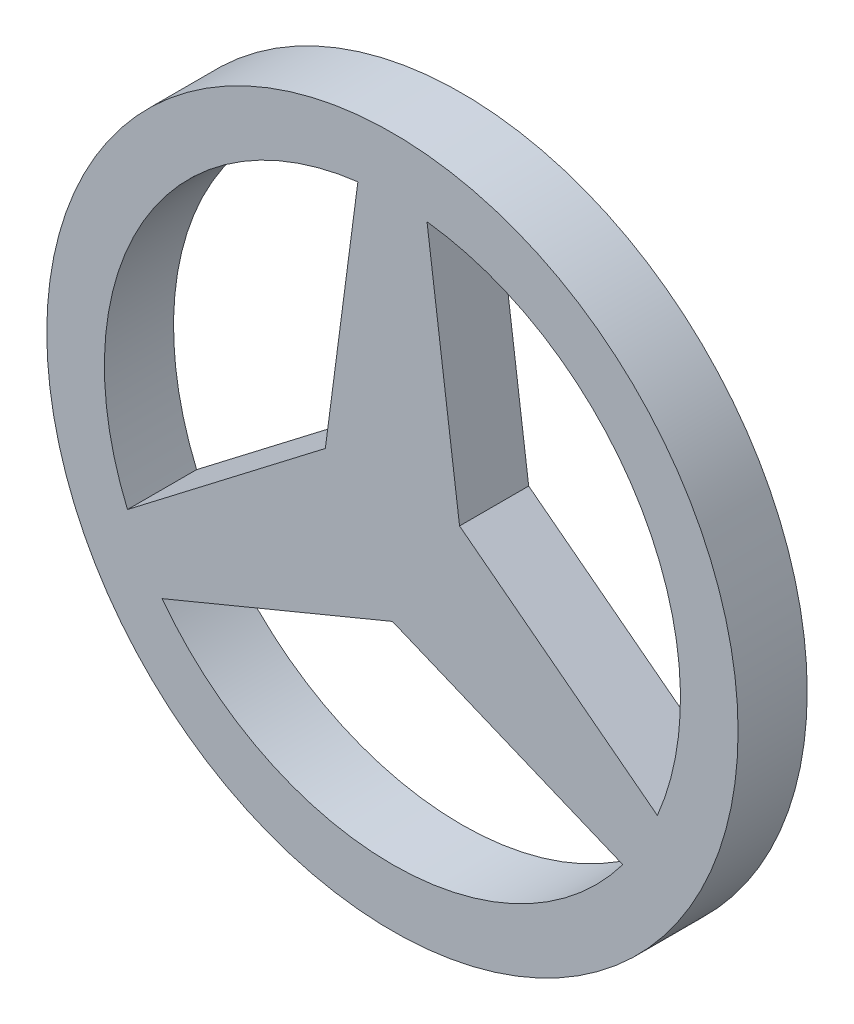
ISO-10303-21;
HEADER;
FILE_DESCRIPTION(('STEP AP214'),'2;1');
FILE_NAME('part.step','',(''),(''),'','','');
FILE_SCHEMA(('AUTOMOTIVE_DESIGN { 1 0 10303 214 1 1 1 1 }'));
ENDSEC;
DATA;
#1=APPLICATION_CONTEXT('core data for automotive mechanical design processes');
#2=APPLICATION_PROTOCOL_DEFINITION('international standard','automotive_design',2000,#1);
#3=PRODUCT_CONTEXT('',#1,'mechanical');
#4=PRODUCT('Part','Part','',(#3));
#5=PRODUCT_RELATED_PRODUCT_CATEGORY('part','',(#4));
#6=PRODUCT_DEFINITION_FORMATION('','',#4);
#7=PRODUCT_DEFINITION_CONTEXT('part definition',#1,'design');
#8=PRODUCT_DEFINITION('design','',#6,#7);
#9=PRODUCT_DEFINITION_SHAPE('','',#8);
#10=(LENGTH_UNIT() NAMED_UNIT(*) SI_UNIT(.MILLI.,.METRE.));
#11=(NAMED_UNIT(*) PLANE_ANGLE_UNIT() SI_UNIT($,.RADIAN.));
#12=(NAMED_UNIT(*) SI_UNIT($,.STERADIAN.) SOLID_ANGLE_UNIT());
#13=UNCERTAINTY_MEASURE_WITH_UNIT(LENGTH_MEASURE(1.E-05),#10,'distance_accuracy_value','');
#14=(GEOMETRIC_REPRESENTATION_CONTEXT(3) GLOBAL_UNCERTAINTY_ASSIGNED_CONTEXT((#13)) GLOBAL_UNIT_ASSIGNED_CONTEXT((#10,
#11,#12)) REPRESENTATION_CONTEXT('',''));
#15=CARTESIAN_POINT('',(0.,0.,0.));
#16=DIRECTION('',(0.,0.,1.));
#17=DIRECTION('',(1.,0.,0.));
#18=AXIS2_PLACEMENT_3D('',#15,#16,#17);
#19=CARTESIAN_POINT('',(3.08037431126138,0.405538971581598,3.));
#20=DIRECTION('',(0.991444861373811,0.130526192220046,0.));
#21=DIRECTION('',(-0.130526192220046,0.991444861373811,0.));
#22=AXIS2_PLACEMENT_3D('',#19,#20,#21);
#23=PLANE('',#22);
#24=DIRECTION('',(0.130526192220046,-0.991444861373811,0.));
#25=VECTOR('',#24,1.);
#26=CARTESIAN_POINT('',(3.08037431126138,0.405538971581598,0.));
#27=LINE('',#26,#25);
#28=CARTESIAN_POINT('',(1.5,12.4096736459909,0.));
#29=VERTEX_POINT('',#28);
#30=CARTESIAN_POINT('',(2.91239456916143,1.6814717884918,0.));
#31=VERTEX_POINT('',#30);
#32=EDGE_CURVE('E116',#29,#31,#27,.T.);
#33=ORIENTED_EDGE('',*,*,#32,.F.);
#34=DIRECTION('',(0.,0.,-1.));
#35=VECTOR('',#34,1.);
#36=CARTESIAN_POINT('',(1.5,12.4096736459909,3.));
#37=LINE('',#36,#35);
#38=CARTESIAN_POINT('',(1.5,12.4096736459909,3.));
#39=VERTEX_POINT('',#38);
#40=EDGE_CURVE('E11',#39,#29,#37,.T.);
#41=ORIENTED_EDGE('',*,*,#40,.F.);
#42=DIRECTION('',(0.130526192220046,-0.991444861373811,0.));
#43=VECTOR('',#42,1.);
#44=CARTESIAN_POINT('',(3.08037431126138,0.405538971581598,3.));
#45=LINE('',#44,#43);
#46=CARTESIAN_POINT('',(2.91239456916143,1.6814717884918,3.));
#47=VERTEX_POINT('',#46);
#48=EDGE_CURVE('E114',#39,#47,#45,.T.);
#49=ORIENTED_EDGE('',*,*,#48,.T.);
#50=DIRECTION('',(0.,0.,-1.));
#51=VECTOR('',#50,1.);
#52=CARTESIAN_POINT('',(2.91239456916143,1.6814717884918,3.));
#53=LINE('',#52,#51);
#54=EDGE_CURVE('E58',#47,#31,#53,.T.);
#55=ORIENTED_EDGE('',*,*,#54,.T.);
#56=EDGE_LOOP('',(#33,#41,#49,#55));
#57=FACE_BOUND('',#56,.T.);
#58=ADVANCED_FACE('F39',(#57),#23,.T.);
#59=CARTESIAN_POINT('',(0.,0.,3.));
#60=DIRECTION('',(0.,0.,-1.));
#61=DIRECTION('',(-1.,0.,0.));
#62=AXIS2_PLACEMENT_3D('',#59,#60,#61);
#63=CYLINDRICAL_SURFACE('',#62,12.5);
#64=CARTESIAN_POINT('',(0.,0.,0.));
#65=DIRECTION('',(0.,0.,1.));
#66=DIRECTION('',(1.,0.,0.));
#67=AXIS2_PLACEMENT_3D('',#64,#65,#66);
#68=CIRCLE('',#67,12.5);
#69=CARTESIAN_POINT('',(11.4970926301023,-4.90579871731878,0.));
#70=VERTEX_POINT('',#69);
#71=EDGE_CURVE('E147',#70,#29,#68,.T.);
#72=ORIENTED_EDGE('',*,*,#71,.F.);
#73=DIRECTION('',(0.,0.,-1.));
#74=VECTOR('',#73,1.);
#75=CARTESIAN_POINT('',(11.4970926301023,-4.90579871731878,3.));
#76=LINE('',#75,#74);
#77=CARTESIAN_POINT('',(11.4970926301023,-4.90579871731878,3.));
#78=VERTEX_POINT('',#77);
#79=EDGE_CURVE('E49',#78,#70,#76,.T.);
#80=ORIENTED_EDGE('',*,*,#79,.F.);
#81=CARTESIAN_POINT('',(0.,0.,3.));
#82=DIRECTION('',(0.,0.,1.));
#83=DIRECTION('',(1.,0.,0.));
#84=AXIS2_PLACEMENT_3D('',#81,#82,#83);
#85=CIRCLE('',#84,12.5);
#86=EDGE_CURVE('E124',#78,#39,#85,.T.);
#87=ORIENTED_EDGE('',*,*,#86,.T.);
#88=ORIENTED_EDGE('',*,*,#40,.T.);
#89=EDGE_LOOP('',(#72,#80,#87,#88));
#90=FACE_BOUND('',#89,.T.);
#91=ADVANCED_FACE('F128',(#90),#63,.F.);
#92=CARTESIAN_POINT('',(-9.99709263010233,-7.5038749286721,0.));
#93=VERTEX_POINT('',#92);
#94=CARTESIAN_POINT('',(9.99709263010233,-7.5038749286721,0.));
#95=VERTEX_POINT('',#94);
#96=EDGE_CURVE('E180',#93,#95,#68,.T.);
#97=ORIENTED_EDGE('',*,*,#96,.F.);
#98=DIRECTION('',(0.,0.,-1.));
#99=VECTOR('',#98,1.);
#100=CARTESIAN_POINT('',(-9.99709263010233,-7.5038749286721,3.));
#101=LINE('',#100,#99);
#102=CARTESIAN_POINT('',(-9.99709263010233,-7.5038749286721,3.));
#103=VERTEX_POINT('',#102);
#104=EDGE_CURVE('E152',#103,#93,#101,.T.);
#105=ORIENTED_EDGE('',*,*,#104,.F.);
#106=CARTESIAN_POINT('',(9.99709263010233,-7.5038749286721,3.));
#107=VERTEX_POINT('',#106);
#108=EDGE_CURVE('E130',#103,#107,#85,.T.);
#109=ORIENTED_EDGE('',*,*,#108,.T.);
#110=DIRECTION('',(0.,0.,-1.));
#111=VECTOR('',#110,1.);
#112=CARTESIAN_POINT('',(9.99709263010233,-7.5038749286721,3.));
#113=LINE('',#112,#111);
#114=EDGE_CURVE('E154',#107,#95,#113,.T.);
#115=ORIENTED_EDGE('',*,*,#114,.T.);
#116=EDGE_LOOP('',(#97,#105,#109,#115));
#117=FACE_BOUND('',#116,.T.);
#118=ADVANCED_FACE('F212',(#117),#63,.F.);
#119=CARTESIAN_POINT('',(1.18898010401641,-2.87045189250816,3.));
#120=DIRECTION('',(0.382683432365094,-0.923879532511285,0.));
#121=DIRECTION('',(0.923879532511285,0.382683432365094,0.));
#122=AXIS2_PLACEMENT_3D('',#119,#120,#121);
#123=PLANE('',#122);
#124=DIRECTION('',(-0.923879532511285,-0.382683432365094,0.));
#125=VECTOR('',#124,1.);
#126=CARTESIAN_POINT('',(1.18898010401641,-2.87045189250816,0.));
#127=LINE('',#126,#125);
#128=CARTESIAN_POINT('',(0.,-3.36294357698354,0.));
#129=VERTEX_POINT('',#128);
#130=EDGE_CURVE('E183',#129,#93,#127,.T.);
#131=ORIENTED_EDGE('',*,*,#130,.F.);
#132=DIRECTION('',(0.,0.,-1.));
#133=VECTOR('',#132,1.);
#134=CARTESIAN_POINT('',(0.,-3.36294357698354,3.));
#135=LINE('',#134,#133);
#136=CARTESIAN_POINT('',(0.,-3.36294357698354,3.));
#137=VERTEX_POINT('',#136);
#138=EDGE_CURVE('E156',#137,#129,#135,.T.);
#139=ORIENTED_EDGE('',*,*,#138,.F.);
#140=DIRECTION('',(-0.923879532511285,-0.382683432365094,0.));
#141=VECTOR('',#140,1.);
#142=CARTESIAN_POINT('',(1.18898010401641,-2.87045189250816,3.));
#143=LINE('',#142,#141);
#144=EDGE_CURVE('E136',#137,#103,#143,.T.);
#145=ORIENTED_EDGE('',*,*,#144,.T.);
#146=ORIENTED_EDGE('',*,*,#104,.T.);
#147=EDGE_LOOP('',(#131,#139,#145,#146));
#148=FACE_BOUND('',#147,.T.);
#149=ADVANCED_FACE('F214',(#148),#123,.T.);
#150=CARTESIAN_POINT('',(-1.5,12.4096736459909,0.));
#151=VERTEX_POINT('',#150);
#152=CARTESIAN_POINT('',(-11.4970926301023,-4.90579871731878,0.));
#153=VERTEX_POINT('',#152);
#154=EDGE_CURVE('E174',#151,#153,#68,.T.);
#155=ORIENTED_EDGE('',*,*,#154,.F.);
#156=DIRECTION('',(0.,0.,-1.));
#157=VECTOR('',#156,1.);
#158=CARTESIAN_POINT('',(-1.5,12.4096736459909,3.));
#159=LINE('',#158,#157);
#160=CARTESIAN_POINT('',(-1.5,12.4096736459909,3.));
#161=VERTEX_POINT('',#160);
#162=EDGE_CURVE('E43',#161,#151,#159,.T.);
#163=ORIENTED_EDGE('',*,*,#162,.F.);
#164=CARTESIAN_POINT('',(-11.4970926301023,-4.90579871731878,3.));
#165=VERTEX_POINT('',#164);
#166=EDGE_CURVE('E131',#161,#165,#85,.T.);
#167=ORIENTED_EDGE('',*,*,#166,.T.);
#168=DIRECTION('',(0.,0.,-1.));
#169=VECTOR('',#168,1.);
#170=CARTESIAN_POINT('',(-11.4970926301023,-4.90579871731878,3.));
#171=LINE('',#170,#169);
#172=EDGE_CURVE('E159',#165,#153,#171,.T.);
#173=ORIENTED_EDGE('',*,*,#172,.T.);
#174=EDGE_LOOP('',(#155,#163,#167,#173));
#175=FACE_BOUND('',#174,.T.);
#176=ADVANCED_FACE('F177',(#175),#63,.F.);
#177=CARTESIAN_POINT('',(-3.0803743112615,0.40553897158165,3.));
#178=DIRECTION('',(0.99144486137381,-0.130526192220057,0.));
#179=DIRECTION('',(0.130526192220057,0.99144486137381,0.));
#180=AXIS2_PLACEMENT_3D('',#177,#178,#179);
#181=PLANE('',#180);
#182=DIRECTION('',(-0.130526192220057,-0.99144486137381,0.));
#183=VECTOR('',#182,1.);
#184=CARTESIAN_POINT('',(-3.0803743112615,0.40553897158165,0.));
#185=LINE('',#184,#183);
#186=CARTESIAN_POINT('',(-2.91239456916155,1.6814717884918,0.));
#187=VERTEX_POINT('',#186);
#188=EDGE_CURVE('E169',#151,#187,#185,.T.);
#189=ORIENTED_EDGE('',*,*,#188,.T.);
#190=DIRECTION('',(0.,0.,-1.));
#191=VECTOR('',#190,1.);
#192=CARTESIAN_POINT('',(-2.91239456916155,1.6814717884918,3.));
#193=LINE('',#192,#191);
#194=CARTESIAN_POINT('',(-2.91239456916155,1.6814717884918,3.));
#195=VERTEX_POINT('',#194);
#196=EDGE_CURVE('E160',#195,#187,#193,.T.);
#197=ORIENTED_EDGE('',*,*,#196,.F.);
#198=DIRECTION('',(-0.130526192220057,-0.99144486137381,0.));
#199=VECTOR('',#198,1.);
#200=CARTESIAN_POINT('',(-3.0803743112615,0.40553897158165,3.));
#201=LINE('',#200,#199);
#202=EDGE_CURVE('E138',#161,#195,#201,.T.);
#203=ORIENTED_EDGE('',*,*,#202,.F.);
#204=ORIENTED_EDGE('',*,*,#162,.T.);
#205=EDGE_LOOP('',(#189,#197,#203,#204));
#206=FACE_BOUND('',#205,.T.);
#207=ADVANCED_FACE('F41',(#206),#181,.F.);
#208=CARTESIAN_POINT('',(1.891394207245,2.46491292092657,3.));
#209=DIRECTION('',(0.60876142900872,0.793353340291236,0.));
#210=DIRECTION('',(-0.793353340291236,0.60876142900872,0.));
#211=AXIS2_PLACEMENT_3D('',#208,#209,#210);
#212=PLANE('',#211);
#213=DIRECTION('',(0.793353340291236,-0.60876142900872,0.));
#214=VECTOR('',#213,1.);
#215=CARTESIAN_POINT('',(1.891394207245,2.46491292092657,0.));
#216=LINE('',#215,#214);
#217=EDGE_CURVE('E142',#31,#70,#216,.T.);
#218=ORIENTED_EDGE('',*,*,#217,.F.);
#219=ORIENTED_EDGE('',*,*,#54,.F.);
#220=DIRECTION('',(0.793353340291236,-0.60876142900872,0.));
#221=VECTOR('',#220,1.);
#222=CARTESIAN_POINT('',(1.891394207245,2.46491292092657,3.));
#223=LINE('',#222,#221);
#224=EDGE_CURVE('E125',#47,#78,#223,.T.);
#225=ORIENTED_EDGE('',*,*,#224,.T.);
#226=ORIENTED_EDGE('',*,*,#79,.T.);
#227=EDGE_LOOP('',(#218,#219,#225,#226));
#228=FACE_BOUND('',#227,.T.);
#229=ADVANCED_FACE('F194',(#228),#212,.T.);
#230=CARTESIAN_POINT('',(-1.18898010401641,-2.87045189250816,3.));
#231=DIRECTION('',(-0.382683432365094,-0.923879532511285,0.));
#232=DIRECTION('',(0.923879532511285,-0.382683432365094,0.));
#233=AXIS2_PLACEMENT_3D('',#230,#231,#232);
#234=PLANE('',#233);
#235=DIRECTION('',(-0.923879532511285,0.382683432365094,0.));
#236=VECTOR('',#235,1.);
#237=CARTESIAN_POINT('',(-1.18898010401641,-2.87045189250816,0.));
#238=LINE('',#237,#236);
#239=EDGE_CURVE('E188',#95,#129,#238,.T.);
#240=ORIENTED_EDGE('',*,*,#239,.F.);
#241=ORIENTED_EDGE('',*,*,#114,.F.);
#242=DIRECTION('',(-0.923879532511285,0.382683432365094,0.));
#243=VECTOR('',#242,1.);
#244=CARTESIAN_POINT('',(-1.18898010401641,-2.87045189250816,3.));
#245=LINE('',#244,#243);
#246=EDGE_CURVE('E126',#107,#137,#245,.T.);
#247=ORIENTED_EDGE('',*,*,#246,.T.);
#248=ORIENTED_EDGE('',*,*,#138,.T.);
#249=EDGE_LOOP('',(#240,#241,#247,#248));
#250=FACE_BOUND('',#249,.T.);
#251=ADVANCED_FACE('F196',(#250),#234,.T.);
#252=CARTESIAN_POINT('',(-1.89139420724507,2.46491292092662,3.));
#253=DIRECTION('',(0.608761429008725,-0.793353340291232,0.));
#254=DIRECTION('',(0.793353340291232,0.608761429008725,0.));
#255=AXIS2_PLACEMENT_3D('',#252,#253,#254);
#256=PLANE('',#255);
#257=DIRECTION('',(-0.793353340291232,-0.608761429008725,0.));
#258=VECTOR('',#257,1.);
#259=CARTESIAN_POINT('',(-1.89139420724507,2.46491292092662,0.));
#260=LINE('',#259,#258);
#261=EDGE_CURVE('E175',#187,#153,#260,.T.);
#262=ORIENTED_EDGE('',*,*,#261,.T.);
#263=ORIENTED_EDGE('',*,*,#172,.F.);
#264=DIRECTION('',(-0.793353340291232,-0.608761429008725,0.));
#265=VECTOR('',#264,1.);
#266=CARTESIAN_POINT('',(-1.89139420724507,2.46491292092662,3.));
#267=LINE('',#266,#265);
#268=EDGE_CURVE('E137',#195,#165,#267,.T.);
#269=ORIENTED_EDGE('',*,*,#268,.F.);
#270=ORIENTED_EDGE('',*,*,#196,.T.);
#271=EDGE_LOOP('',(#262,#263,#269,#270));
#272=FACE_BOUND('',#271,.T.);
#273=ADVANCED_FACE('F202',(#272),#256,.F.);
#274=CARTESIAN_POINT('',(0.,0.,3.));
#275=DIRECTION('',(0.,0.,-1.));
#276=DIRECTION('',(-1.,0.,0.));
#277=AXIS2_PLACEMENT_3D('',#274,#275,#276);
#278=CYLINDRICAL_SURFACE('',#277,15.);
#279=CARTESIAN_POINT('',(0.,0.,3.));
#280=DIRECTION('',(0.,0.,1.));
#281=DIRECTION('',(1.,0.,0.));
#282=AXIS2_PLACEMENT_3D('',#279,#280,#281);
#283=CIRCLE('',#282,15.);
#284=CARTESIAN_POINT('',(15.,0.,3.));
#285=VERTEX_POINT('',#284);
#286=EDGE_CURVE('E132',#285,#285,#283,.T.);
#287=ORIENTED_EDGE('',*,*,#286,.F.);
#288=EDGE_LOOP('',(#287));
#289=FACE_BOUND('',#288,.T.);
#290=CARTESIAN_POINT('',(0.,0.,0.));
#291=DIRECTION('',(0.,0.,1.));
#292=DIRECTION('',(1.,0.,0.));
#293=AXIS2_PLACEMENT_3D('',#290,#291,#292);
#294=CIRCLE('',#293,15.);
#295=CARTESIAN_POINT('',(15.,0.,0.));
#296=VERTEX_POINT('',#295);
#297=EDGE_CURVE('E139',#296,#296,#294,.T.);
#298=ORIENTED_EDGE('',*,*,#297,.T.);
#299=EDGE_LOOP('',(#298));
#300=FACE_BOUND('',#299,.T.);
#301=ADVANCED_FACE('F218',(#289,#300),#278,.T.);
#302=CARTESIAN_POINT('',(0.,0.,3.));
#303=DIRECTION('',(0.,0.,1.));
#304=DIRECTION('',(1.,0.,0.));
#305=AXIS2_PLACEMENT_3D('',#302,#303,#304);
#306=PLANE('',#305);
#307=ORIENTED_EDGE('',*,*,#166,.F.);
#308=ORIENTED_EDGE('',*,*,#202,.T.);
#309=ORIENTED_EDGE('',*,*,#268,.T.);
#310=EDGE_LOOP('',(#307,#308,#309));
#311=FACE_BOUND('',#310,.T.);
#312=ORIENTED_EDGE('',*,*,#108,.F.);
#313=ORIENTED_EDGE('',*,*,#144,.F.);
#314=ORIENTED_EDGE('',*,*,#246,.F.);
#315=EDGE_LOOP('',(#312,#313,#314));
#316=FACE_BOUND('',#315,.T.);
#317=ORIENTED_EDGE('',*,*,#48,.F.);
#318=ORIENTED_EDGE('',*,*,#86,.F.);
#319=ORIENTED_EDGE('',*,*,#224,.F.);
#320=EDGE_LOOP('',(#317,#318,#319));
#321=FACE_BOUND('',#320,.T.);
#322=ORIENTED_EDGE('',*,*,#286,.T.);
#323=EDGE_LOOP('',(#322));
#324=FACE_BOUND('',#323,.T.);
#325=ADVANCED_FACE('F122',(#311,#316,#321,#324),#306,.T.);
#326=CARTESIAN_POINT('',(0.,0.,0.));
#327=DIRECTION('',(0.,0.,1.));
#328=DIRECTION('',(1.,0.,0.));
#329=AXIS2_PLACEMENT_3D('',#326,#327,#328);
#330=PLANE('',#329);
#331=ORIENTED_EDGE('',*,*,#154,.T.);
#332=ORIENTED_EDGE('',*,*,#261,.F.);
#333=ORIENTED_EDGE('',*,*,#188,.F.);
#334=EDGE_LOOP('',(#331,#332,#333));
#335=FACE_BOUND('',#334,.T.);
#336=ORIENTED_EDGE('',*,*,#96,.T.);
#337=ORIENTED_EDGE('',*,*,#239,.T.);
#338=ORIENTED_EDGE('',*,*,#130,.T.);
#339=EDGE_LOOP('',(#336,#337,#338));
#340=FACE_BOUND('',#339,.T.);
#341=ORIENTED_EDGE('',*,*,#32,.T.);
#342=ORIENTED_EDGE('',*,*,#217,.T.);
#343=ORIENTED_EDGE('',*,*,#71,.T.);
#344=EDGE_LOOP('',(#341,#342,#343));
#345=FACE_BOUND('',#344,.T.);
#346=ORIENTED_EDGE('',*,*,#297,.F.);
#347=EDGE_LOOP('',(#346));
#348=FACE_BOUND('',#347,.T.);
#349=ADVANCED_FACE('F172',(#335,#340,#345,#348),#330,.F.);
#350=CLOSED_SHELL('',(#58,#91,#118,#149,#176,#207,#229,#251,#273,#301,#325,#349));
#351=MANIFOLD_SOLID_BREP('B2',#350);
#352=ADVANCED_BREP_SHAPE_REPRESENTATION('',(#18,#351),#14);
#353=SHAPE_DEFINITION_REPRESENTATION(#9,#352);
ENDSEC;
END-ISO-10303-21;
